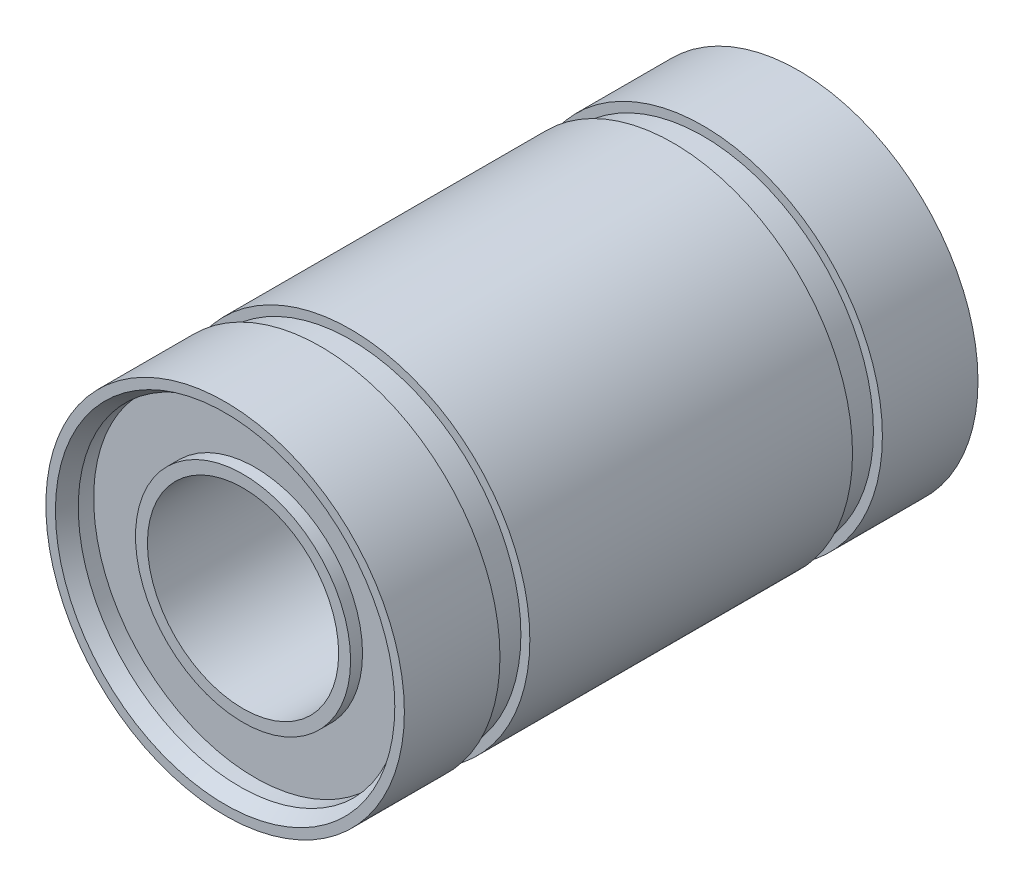
ISO-10303-21;
HEADER;
FILE_DESCRIPTION(('STEP AP214'),'2;1');
FILE_NAME('part.step','',(''),(''),'','','');
FILE_SCHEMA(('AUTOMOTIVE_DESIGN { 1 0 10303 214 1 1 1 1 }'));
ENDSEC;
DATA;
#1=APPLICATION_CONTEXT('core data for automotive mechanical design processes');
#2=APPLICATION_PROTOCOL_DEFINITION('international standard','automotive_design',2000,#1);
#3=PRODUCT_CONTEXT('',#1,'mechanical');
#4=PRODUCT('Part','Part','',(#3));
#5=PRODUCT_RELATED_PRODUCT_CATEGORY('part','',(#4));
#6=PRODUCT_DEFINITION_FORMATION('','',#4);
#7=PRODUCT_DEFINITION_CONTEXT('part definition',#1,'design');
#8=PRODUCT_DEFINITION('design','',#6,#7);
#9=PRODUCT_DEFINITION_SHAPE('','',#8);
#10=(LENGTH_UNIT() NAMED_UNIT(*) SI_UNIT(.MILLI.,.METRE.));
#11=(NAMED_UNIT(*) PLANE_ANGLE_UNIT() SI_UNIT($,.RADIAN.));
#12=(NAMED_UNIT(*) SI_UNIT($,.STERADIAN.) SOLID_ANGLE_UNIT());
#13=UNCERTAINTY_MEASURE_WITH_UNIT(LENGTH_MEASURE(1.E-05),#10,'distance_accuracy_value','');
#14=(GEOMETRIC_REPRESENTATION_CONTEXT(3) GLOBAL_UNCERTAINTY_ASSIGNED_CONTEXT((#13)) GLOBAL_UNIT_ASSIGNED_CONTEXT((#10,
#11,#12)) REPRESENTATION_CONTEXT('',''));
#15=CARTESIAN_POINT('',(0.,0.,0.));
#16=DIRECTION('',(0.,0.,1.));
#17=DIRECTION('',(1.,0.,0.));
#18=AXIS2_PLACEMENT_3D('',#15,#16,#17);
#19=CARTESIAN_POINT('',(0.,0.,12.));
#20=DIRECTION('',(0.,0.,-1.));
#21=DIRECTION('',(-1.,0.,0.));
#22=AXIS2_PLACEMENT_3D('',#19,#20,#21);
#23=CYLINDRICAL_SURFACE('',#22,7.5);
#24=CARTESIAN_POINT('',(0.,0.,6.75));
#25=DIRECTION('',(0.,0.,1.));
#26=DIRECTION('',(1.,0.,0.));
#27=AXIS2_PLACEMENT_3D('',#24,#25,#26);
#28=CIRCLE('',#27,7.5);
#29=CARTESIAN_POINT('',(7.5,0.,6.75));
#30=VERTEX_POINT('',#29);
#31=EDGE_CURVE('E73',#30,#30,#28,.T.);
#32=ORIENTED_EDGE('',*,*,#31,.F.);
#33=EDGE_LOOP('',(#32));
#34=FACE_BOUND('',#33,.T.);
#35=CARTESIAN_POINT('',(0.,0.,-6.75));
#36=DIRECTION('',(0.,0.,1.));
#37=DIRECTION('',(1.,0.,0.));
#38=AXIS2_PLACEMENT_3D('',#35,#36,#37);
#39=CIRCLE('',#38,7.5);
#40=CARTESIAN_POINT('',(7.5,0.,-6.75));
#41=VERTEX_POINT('',#40);
#42=EDGE_CURVE('E94',#41,#41,#39,.T.);
#43=ORIENTED_EDGE('',*,*,#42,.T.);
#44=EDGE_LOOP('',(#43));
#45=FACE_BOUND('',#44,.T.);
#46=ADVANCED_FACE('F32',(#34,#45),#23,.T.);
#47=CARTESIAN_POINT('',(0.,0.,12.));
#48=DIRECTION('',(0.,0.,-1.));
#49=DIRECTION('',(-1.,0.,0.));
#50=AXIS2_PLACEMENT_3D('',#47,#48,#49);
#51=CYLINDRICAL_SURFACE('',#50,4.);
#52=CARTESIAN_POINT('',(0.,0.,11.25));
#53=DIRECTION('',(0.,0.,1.));
#54=DIRECTION('',(1.,0.,0.));
#55=AXIS2_PLACEMENT_3D('',#52,#53,#54);
#56=CIRCLE('',#55,4.);
#57=CARTESIAN_POINT('',(4.,0.,11.25));
#58=VERTEX_POINT('',#57);
#59=EDGE_CURVE('E68',#58,#58,#56,.T.);
#60=ORIENTED_EDGE('',*,*,#59,.T.);
#61=EDGE_LOOP('',(#60));
#62=FACE_BOUND('',#61,.T.);
#63=CARTESIAN_POINT('',(0.,0.,-11.25));
#64=DIRECTION('',(0.,0.,1.));
#65=DIRECTION('',(1.,0.,0.));
#66=AXIS2_PLACEMENT_3D('',#63,#64,#65);
#67=CIRCLE('',#66,4.);
#68=CARTESIAN_POINT('',(4.,0.,-11.25));
#69=VERTEX_POINT('',#68);
#70=EDGE_CURVE('E91',#69,#69,#67,.T.);
#71=ORIENTED_EDGE('',*,*,#70,.F.);
#72=EDGE_LOOP('',(#71));
#73=FACE_BOUND('',#72,.T.);
#74=ADVANCED_FACE('F127',(#62,#73),#51,.F.);
#75=CARTESIAN_POINT('',(0.,0.,-8.));
#76=DIRECTION('',(0.,0.,1.));
#77=DIRECTION('',(1.,0.,0.));
#78=AXIS2_PLACEMENT_3D('',#75,#76,#77);
#79=CIRCLE('',#78,7.5);
#80=CARTESIAN_POINT('',(7.5,0.,-8.));
#81=VERTEX_POINT('',#80);
#82=EDGE_CURVE('E95',#81,#81,#79,.T.);
#83=ORIENTED_EDGE('',*,*,#82,.F.);
#84=EDGE_LOOP('',(#83));
#85=FACE_BOUND('',#84,.T.);
#86=CARTESIAN_POINT('',(0.,0.,-12.));
#87=DIRECTION('',(0.,0.,1.));
#88=DIRECTION('',(1.,0.,0.));
#89=AXIS2_PLACEMENT_3D('',#86,#87,#88);
#90=CIRCLE('',#89,7.5);
#91=CARTESIAN_POINT('',(7.5,0.,-12.));
#92=VERTEX_POINT('',#91);
#93=EDGE_CURVE('E56',#92,#92,#90,.T.);
#94=ORIENTED_EDGE('',*,*,#93,.T.);
#95=EDGE_LOOP('',(#94));
#96=FACE_BOUND('',#95,.T.);
#97=ADVANCED_FACE('F130',(#85,#96),#23,.T.);
#98=CARTESIAN_POINT('',(0.,0.,10.75));
#99=DIRECTION('',(0.,0.,1.));
#100=DIRECTION('',(1.,0.,0.));
#101=AXIS2_PLACEMENT_3D('',#98,#99,#100);
#102=PLANE('',#101);
#103=CARTESIAN_POINT('',(0.,0.,10.75));
#104=DIRECTION('',(0.,0.,1.));
#105=DIRECTION('',(1.,0.,0.));
#106=AXIS2_PLACEMENT_3D('',#103,#104,#105);
#107=CIRCLE('',#106,6.75);
#108=CARTESIAN_POINT('',(6.75,0.,10.75));
#109=VERTEX_POINT('',#108);
#110=EDGE_CURVE('E59',#109,#109,#107,.T.);
#111=ORIENTED_EDGE('',*,*,#110,.T.);
#112=EDGE_LOOP('',(#111));
#113=FACE_BOUND('',#112,.T.);
#114=CARTESIAN_POINT('',(0.,0.,10.75));
#115=DIRECTION('',(0.,0.,1.));
#116=DIRECTION('',(1.,0.,0.));
#117=AXIS2_PLACEMENT_3D('',#114,#115,#116);
#118=CIRCLE('',#117,4.5);
#119=CARTESIAN_POINT('',(4.5,0.,10.75));
#120=VERTEX_POINT('',#119);
#121=EDGE_CURVE('E65',#120,#120,#118,.T.);
#122=ORIENTED_EDGE('',*,*,#121,.F.);
#123=EDGE_LOOP('',(#122));
#124=FACE_BOUND('',#123,.T.);
#125=ADVANCED_FACE('F141',(#113,#124),#102,.T.);
#126=CARTESIAN_POINT('',(0.,0.,12.));
#127=DIRECTION('',(0.,0.,1.));
#128=DIRECTION('',(1.,0.,0.));
#129=AXIS2_PLACEMENT_3D('',#126,#127,#128);
#130=PLANE('',#129);
#131=CARTESIAN_POINT('',(0.,0.,12.));
#132=DIRECTION('',(0.,0.,1.));
#133=DIRECTION('',(1.,0.,0.));
#134=AXIS2_PLACEMENT_3D('',#131,#132,#133);
#135=CIRCLE('',#134,7.1);
#136=CARTESIAN_POINT('',(7.1,0.,12.));
#137=VERTEX_POINT('',#136);
#138=EDGE_CURVE('E47',#137,#137,#135,.F.);
#139=ORIENTED_EDGE('',*,*,#138,.T.);
#140=EDGE_LOOP('',(#139));
#141=FACE_BOUND('',#140,.T.);
#142=CARTESIAN_POINT('',(0.,0.,12.));
#143=DIRECTION('',(0.,0.,1.));
#144=DIRECTION('',(1.,0.,0.));
#145=AXIS2_PLACEMENT_3D('',#142,#143,#144);
#146=CIRCLE('',#145,7.5);
#147=CARTESIAN_POINT('',(7.5,0.,12.));
#148=VERTEX_POINT('',#147);
#149=EDGE_CURVE('E55',#148,#148,#146,.T.);
#150=ORIENTED_EDGE('',*,*,#149,.T.);
#151=EDGE_LOOP('',(#150));
#152=FACE_BOUND('',#151,.T.);
#153=ADVANCED_FACE('F154',(#141,#152),#130,.T.);
#154=CARTESIAN_POINT('',(0.,0.,-12.));
#155=DIRECTION('',(0.,0.,1.));
#156=DIRECTION('',(1.,0.,0.));
#157=AXIS2_PLACEMENT_3D('',#154,#155,#156);
#158=PLANE('',#157);
#159=CARTESIAN_POINT('',(0.,0.,-12.));
#160=DIRECTION('',(0.,0.,1.));
#161=DIRECTION('',(1.,0.,0.));
#162=AXIS2_PLACEMENT_3D('',#159,#160,#161);
#163=CIRCLE('',#162,7.1);
#164=CARTESIAN_POINT('',(7.1,0.,-12.));
#165=VERTEX_POINT('',#164);
#166=EDGE_CURVE('E39',#165,#165,#163,.T.);
#167=ORIENTED_EDGE('',*,*,#166,.T.);
#168=EDGE_LOOP('',(#167));
#169=FACE_BOUND('',#168,.T.);
#170=ORIENTED_EDGE('',*,*,#93,.F.);
#171=EDGE_LOOP('',(#170));
#172=FACE_BOUND('',#171,.T.);
#173=ADVANCED_FACE('F145',(#169,#172),#158,.F.);
#174=CARTESIAN_POINT('',(0.,0.,8.));
#175=DIRECTION('',(0.,0.,1.));
#176=DIRECTION('',(1.,0.,0.));
#177=AXIS2_PLACEMENT_3D('',#174,#175,#176);
#178=CIRCLE('',#177,7.5);
#179=CARTESIAN_POINT('',(7.5,0.,8.));
#180=VERTEX_POINT('',#179);
#181=EDGE_CURVE('E74',#180,#180,#178,.T.);
#182=ORIENTED_EDGE('',*,*,#181,.T.);
#183=EDGE_LOOP('',(#182));
#184=FACE_BOUND('',#183,.T.);
#185=ORIENTED_EDGE('',*,*,#149,.F.);
#186=EDGE_LOOP('',(#185));
#187=FACE_BOUND('',#186,.T.);
#188=ADVANCED_FACE('F131',(#184,#187),#23,.T.);
#189=CARTESIAN_POINT('',(0.,0.,10.75));
#190=DIRECTION('',(0.,0.,1.));
#191=DIRECTION('',(1.,0.,0.));
#192=AXIS2_PLACEMENT_3D('',#189,#190,#191);
#193=CYLINDRICAL_SURFACE('',#192,6.75);
#194=CARTESIAN_POINT('',(0.,0.,11.3937822173509));
#195=DIRECTION('',(0.,0.,1.));
#196=DIRECTION('',(1.,0.,0.));
#197=AXIS2_PLACEMENT_3D('',#194,#195,#196);
#198=CIRCLE('',#197,6.75);
#199=CARTESIAN_POINT('',(6.75,0.,11.3937822173509));
#200=VERTEX_POINT('',#199);
#201=EDGE_CURVE('E52',#200,#200,#198,.T.);
#202=ORIENTED_EDGE('',*,*,#201,.T.);
#203=EDGE_LOOP('',(#202));
#204=FACE_BOUND('',#203,.T.);
#205=ORIENTED_EDGE('',*,*,#110,.F.);
#206=EDGE_LOOP('',(#205));
#207=FACE_BOUND('',#206,.T.);
#208=ADVANCED_FACE('F144',(#204,#207),#193,.F.);
#209=CARTESIAN_POINT('',(0.,0.,11.25));
#210=DIRECTION('',(0.,0.,1.));
#211=DIRECTION('',(1.,0.,0.));
#212=AXIS2_PLACEMENT_3D('',#209,#210,#211);
#213=PLANE('',#212);
#214=CARTESIAN_POINT('',(0.,0.,11.25));
#215=DIRECTION('',(0.,0.,1.));
#216=DIRECTION('',(1.,0.,0.));
#217=AXIS2_PLACEMENT_3D('',#214,#215,#216);
#218=CIRCLE('',#217,4.5);
#219=CARTESIAN_POINT('',(4.5,0.,11.25));
#220=VERTEX_POINT('',#219);
#221=EDGE_CURVE('E64',#220,#220,#218,.T.);
#222=ORIENTED_EDGE('',*,*,#221,.T.);
#223=EDGE_LOOP('',(#222));
#224=FACE_BOUND('',#223,.T.);
#225=ORIENTED_EDGE('',*,*,#59,.F.);
#226=EDGE_LOOP('',(#225));
#227=FACE_BOUND('',#226,.T.);
#228=ADVANCED_FACE('F151',(#224,#227),#213,.T.);
#229=CARTESIAN_POINT('',(0.,0.,11.25));
#230=DIRECTION('',(0.,0.,-1.));
#231=DIRECTION('',(-1.,0.,0.));
#232=AXIS2_PLACEMENT_3D('',#229,#230,#231);
#233=CYLINDRICAL_SURFACE('',#232,4.5);
#234=ORIENTED_EDGE('',*,*,#221,.F.);
#235=EDGE_LOOP('',(#234));
#236=FACE_BOUND('',#235,.T.);
#237=ORIENTED_EDGE('',*,*,#121,.T.);
#238=EDGE_LOOP('',(#237));
#239=FACE_BOUND('',#238,.T.);
#240=ADVANCED_FACE('F168',(#236,#239),#233,.T.);
#241=CARTESIAN_POINT('',(0.,0.,11.3937822173509));
#242=DIRECTION('',(0.,0.,1.));
#243=DIRECTION('',(1.,0.,0.));
#244=AXIS2_PLACEMENT_3D('',#241,#242,#243);
#245=CONICAL_SURFACE('',#244,6.75,0.5235987755983);
#246=ORIENTED_EDGE('',*,*,#138,.F.);
#247=EDGE_LOOP('',(#246));
#248=FACE_BOUND('',#247,.T.);
#249=ORIENTED_EDGE('',*,*,#201,.F.);
#250=EDGE_LOOP('',(#249));
#251=FACE_BOUND('',#250,.T.);
#252=ADVANCED_FACE('F171',(#248,#251),#245,.F.);
#253=CARTESIAN_POINT('',(0.,0.,6.75));
#254=DIRECTION('',(0.,0.,1.));
#255=DIRECTION('',(1.,0.,0.));
#256=AXIS2_PLACEMENT_3D('',#253,#254,#255);
#257=PLANE('',#256);
#258=CARTESIAN_POINT('',(0.,0.,6.75));
#259=DIRECTION('',(0.,0.,1.));
#260=DIRECTION('',(1.,0.,0.));
#261=AXIS2_PLACEMENT_3D('',#258,#259,#260);
#262=CIRCLE('',#261,7.125);
#263=CARTESIAN_POINT('',(7.125,0.,6.75));
#264=VERTEX_POINT('',#263);
#265=EDGE_CURVE('E77',#264,#264,#262,.T.);
#266=ORIENTED_EDGE('',*,*,#265,.F.);
#267=EDGE_LOOP('',(#266));
#268=FACE_BOUND('',#267,.T.);
#269=ORIENTED_EDGE('',*,*,#31,.T.);
#270=EDGE_LOOP('',(#269));
#271=FACE_BOUND('',#270,.T.);
#272=ADVANCED_FACE('F180',(#268,#271),#257,.T.);
#273=CARTESIAN_POINT('',(0.,0.,8.));
#274=DIRECTION('',(0.,0.,1.));
#275=DIRECTION('',(1.,0.,0.));
#276=AXIS2_PLACEMENT_3D('',#273,#274,#275);
#277=PLANE('',#276);
#278=CARTESIAN_POINT('',(0.,0.,8.));
#279=DIRECTION('',(0.,0.,1.));
#280=DIRECTION('',(1.,0.,0.));
#281=AXIS2_PLACEMENT_3D('',#278,#279,#280);
#282=CIRCLE('',#281,7.125);
#283=CARTESIAN_POINT('',(7.125,0.,8.));
#284=VERTEX_POINT('',#283);
#285=EDGE_CURVE('E80',#284,#284,#282,.T.);
#286=ORIENTED_EDGE('',*,*,#285,.T.);
#287=EDGE_LOOP('',(#286));
#288=FACE_BOUND('',#287,.T.);
#289=ORIENTED_EDGE('',*,*,#181,.F.);
#290=EDGE_LOOP('',(#289));
#291=FACE_BOUND('',#290,.T.);
#292=ADVANCED_FACE('F176',(#288,#291),#277,.F.);
#293=CARTESIAN_POINT('',(0.,0.,6.75));
#294=DIRECTION('',(0.,0.,1.));
#295=DIRECTION('',(1.,0.,0.));
#296=AXIS2_PLACEMENT_3D('',#293,#294,#295);
#297=CYLINDRICAL_SURFACE('',#296,7.125);
#298=ORIENTED_EDGE('',*,*,#265,.T.);
#299=EDGE_LOOP('',(#298));
#300=FACE_BOUND('',#299,.T.);
#301=ORIENTED_EDGE('',*,*,#285,.F.);
#302=EDGE_LOOP('',(#301));
#303=FACE_BOUND('',#302,.T.);
#304=ADVANCED_FACE('F179',(#300,#303),#297,.T.);
#305=CARTESIAN_POINT('',(0.,0.,-10.75));
#306=DIRECTION('',(0.,0.,-1.));
#307=DIRECTION('',(-1.,0.,0.));
#308=AXIS2_PLACEMENT_3D('',#305,#306,#307);
#309=CYLINDRICAL_SURFACE('',#308,6.75);
#310=CARTESIAN_POINT('',(0.,0.,-11.3937822173509));
#311=DIRECTION('',(0.,0.,1.));
#312=DIRECTION('',(1.,0.,0.));
#313=AXIS2_PLACEMENT_3D('',#310,#311,#312);
#314=CIRCLE('',#313,6.75);
#315=CARTESIAN_POINT('',(6.75,0.,-11.3937822173509));
#316=VERTEX_POINT('',#315);
#317=EDGE_CURVE('E10',#316,#316,#314,.F.);
#318=ORIENTED_EDGE('',*,*,#317,.T.);
#319=EDGE_LOOP('',(#318));
#320=FACE_BOUND('',#319,.T.);
#321=CARTESIAN_POINT('',(0.,0.,-10.75));
#322=DIRECTION('',(0.,0.,1.));
#323=DIRECTION('',(1.,0.,0.));
#324=AXIS2_PLACEMENT_3D('',#321,#322,#323);
#325=CIRCLE('',#324,6.75);
#326=CARTESIAN_POINT('',(6.75,0.,-10.75));
#327=VERTEX_POINT('',#326);
#328=EDGE_CURVE('E83',#327,#327,#325,.T.);
#329=ORIENTED_EDGE('',*,*,#328,.T.);
#330=EDGE_LOOP('',(#329));
#331=FACE_BOUND('',#330,.T.);
#332=ADVANCED_FACE('F187',(#320,#331),#309,.F.);
#333=CARTESIAN_POINT('',(0.,0.,-10.75));
#334=DIRECTION('',(0.,0.,-1.));
#335=DIRECTION('',(1.,0.,0.));
#336=AXIS2_PLACEMENT_3D('',#333,#334,#335);
#337=PLANE('',#336);
#338=CARTESIAN_POINT('',(0.,0.,-10.75));
#339=DIRECTION('',(0.,0.,-1.));
#340=DIRECTION('',(-1.,0.,0.));
#341=AXIS2_PLACEMENT_3D('',#338,#339,#340);
#342=CIRCLE('',#341,4.5);
#343=CARTESIAN_POINT('',(-4.5,0.,-10.75));
#344=VERTEX_POINT('',#343);
#345=EDGE_CURVE('E43',#344,#344,#342,.T.);
#346=ORIENTED_EDGE('',*,*,#345,.F.);
#347=EDGE_LOOP('',(#346));
#348=FACE_BOUND('',#347,.T.);
#349=ORIENTED_EDGE('',*,*,#328,.F.);
#350=EDGE_LOOP('',(#349));
#351=FACE_BOUND('',#350,.T.);
#352=ADVANCED_FACE('F191',(#348,#351),#337,.T.);
#353=CARTESIAN_POINT('',(0.,0.,-11.25));
#354=DIRECTION('',(0.,0.,1.));
#355=DIRECTION('',(1.,0.,0.));
#356=AXIS2_PLACEMENT_3D('',#353,#354,#355);
#357=CYLINDRICAL_SURFACE('',#356,4.5);
#358=CARTESIAN_POINT('',(0.,0.,-11.25));
#359=DIRECTION('',(0.,0.,1.));
#360=DIRECTION('',(1.,0.,0.));
#361=AXIS2_PLACEMENT_3D('',#358,#359,#360);
#362=CIRCLE('',#361,4.5);
#363=CARTESIAN_POINT('',(4.5,0.,-11.25));
#364=VERTEX_POINT('',#363);
#365=EDGE_CURVE('E88',#364,#364,#362,.T.);
#366=ORIENTED_EDGE('',*,*,#365,.T.);
#367=EDGE_LOOP('',(#366));
#368=FACE_BOUND('',#367,.T.);
#369=ORIENTED_EDGE('',*,*,#345,.T.);
#370=EDGE_LOOP('',(#369));
#371=FACE_BOUND('',#370,.T.);
#372=ADVANCED_FACE('F194',(#368,#371),#357,.T.);
#373=CARTESIAN_POINT('',(0.,0.,-11.25));
#374=DIRECTION('',(0.,0.,-1.));
#375=DIRECTION('',(1.,0.,0.));
#376=AXIS2_PLACEMENT_3D('',#373,#374,#375);
#377=PLANE('',#376);
#378=ORIENTED_EDGE('',*,*,#70,.T.);
#379=EDGE_LOOP('',(#378));
#380=FACE_BOUND('',#379,.T.);
#381=ORIENTED_EDGE('',*,*,#365,.F.);
#382=EDGE_LOOP('',(#381));
#383=FACE_BOUND('',#382,.T.);
#384=ADVANCED_FACE('F122',(#380,#383),#377,.T.);
#385=CARTESIAN_POINT('',(0.,0.,-6.75));
#386=DIRECTION('',(0.,0.,-1.));
#387=DIRECTION('',(1.,0.,0.));
#388=AXIS2_PLACEMENT_3D('',#385,#386,#387);
#389=PLANE('',#388);
#390=ORIENTED_EDGE('',*,*,#42,.F.);
#391=EDGE_LOOP('',(#390));
#392=FACE_BOUND('',#391,.T.);
#393=CARTESIAN_POINT('',(0.,0.,-6.75));
#394=DIRECTION('',(0.,0.,1.));
#395=DIRECTION('',(1.,0.,0.));
#396=AXIS2_PLACEMENT_3D('',#393,#394,#395);
#397=CIRCLE('',#396,7.125);
#398=CARTESIAN_POINT('',(7.125,0.,-6.75));
#399=VERTEX_POINT('',#398);
#400=EDGE_CURVE('E98',#399,#399,#397,.T.);
#401=ORIENTED_EDGE('',*,*,#400,.T.);
#402=EDGE_LOOP('',(#401));
#403=FACE_BOUND('',#402,.T.);
#404=ADVANCED_FACE('F107',(#392,#403),#389,.T.);
#405=CARTESIAN_POINT('',(0.,0.,-8.));
#406=DIRECTION('',(0.,0.,-1.));
#407=DIRECTION('',(1.,0.,0.));
#408=AXIS2_PLACEMENT_3D('',#405,#406,#407);
#409=PLANE('',#408);
#410=ORIENTED_EDGE('',*,*,#82,.T.);
#411=EDGE_LOOP('',(#410));
#412=FACE_BOUND('',#411,.T.);
#413=CARTESIAN_POINT('',(0.,0.,-8.));
#414=DIRECTION('',(0.,0.,1.));
#415=DIRECTION('',(1.,0.,0.));
#416=AXIS2_PLACEMENT_3D('',#413,#414,#415);
#417=CIRCLE('',#416,7.125);
#418=CARTESIAN_POINT('',(7.125,0.,-8.));
#419=VERTEX_POINT('',#418);
#420=EDGE_CURVE('E101',#419,#419,#417,.T.);
#421=ORIENTED_EDGE('',*,*,#420,.F.);
#422=EDGE_LOOP('',(#421));
#423=FACE_BOUND('',#422,.T.);
#424=ADVANCED_FACE('F112',(#412,#423),#409,.F.);
#425=CARTESIAN_POINT('',(0.,0.,-6.75));
#426=DIRECTION('',(0.,0.,-1.));
#427=DIRECTION('',(-1.,0.,0.));
#428=AXIS2_PLACEMENT_3D('',#425,#426,#427);
#429=CYLINDRICAL_SURFACE('',#428,7.125);
#430=ORIENTED_EDGE('',*,*,#400,.F.);
#431=EDGE_LOOP('',(#430));
#432=FACE_BOUND('',#431,.T.);
#433=ORIENTED_EDGE('',*,*,#420,.T.);
#434=EDGE_LOOP('',(#433));
#435=FACE_BOUND('',#434,.T.);
#436=ADVANCED_FACE('F109',(#432,#435),#429,.T.);
#437=CARTESIAN_POINT('',(0.,0.,-12.));
#438=DIRECTION('',(0.,0.,-1.));
#439=DIRECTION('',(-1.,0.,0.));
#440=AXIS2_PLACEMENT_3D('',#437,#438,#439);
#441=CONICAL_SURFACE('',#440,7.1,0.5235987755983);
#442=ORIENTED_EDGE('',*,*,#317,.F.);
#443=EDGE_LOOP('',(#442));
#444=FACE_BOUND('',#443,.T.);
#445=ORIENTED_EDGE('',*,*,#166,.F.);
#446=EDGE_LOOP('',(#445));
#447=FACE_BOUND('',#446,.T.);
#448=ADVANCED_FACE('F34',(#444,#447),#441,.F.);
#449=CLOSED_SHELL('',(#46,#74,#97,#125,#153,#173,#188,#208,#228,#240,#252,#272,#292,#304,#332,
#352,#372,#384,#404,#424,#436,#448));
#450=MANIFOLD_SOLID_BREP('B2',#449);
#451=ADVANCED_BREP_SHAPE_REPRESENTATION('',(#18,#450),#14);
#452=SHAPE_DEFINITION_REPRESENTATION(#9,#451);
ENDSEC;
END-ISO-10303-21;
